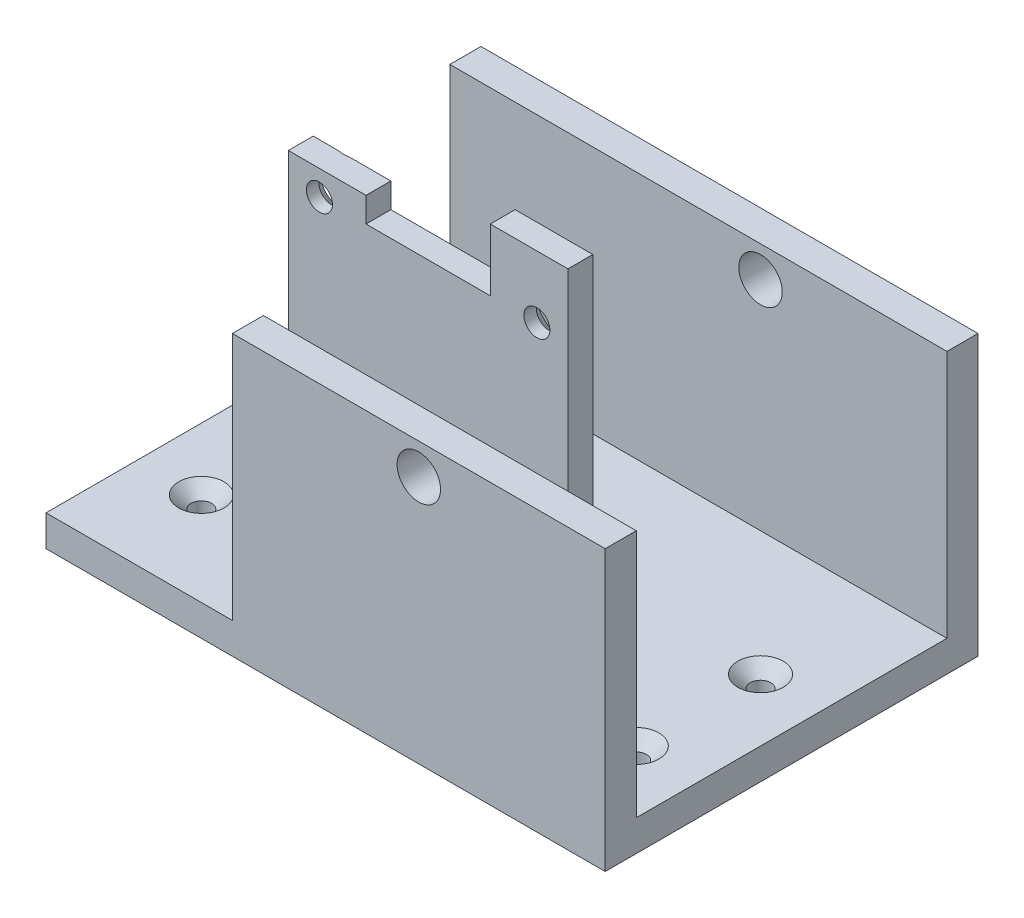
ISO-10303-21;
HEADER;
FILE_DESCRIPTION(('STEP AP214'),'2;1');
FILE_NAME('part.step','',(''),(''),'','','');
FILE_SCHEMA(('AUTOMOTIVE_DESIGN { 1 0 10303 214 1 1 1 1 }'));
ENDSEC;
DATA;
#1=APPLICATION_CONTEXT('core data for automotive mechanical design processes');
#2=APPLICATION_PROTOCOL_DEFINITION('international standard','automotive_design',2000,#1);
#3=PRODUCT_CONTEXT('',#1,'mechanical');
#4=PRODUCT('Part','Part','',(#3));
#5=PRODUCT_RELATED_PRODUCT_CATEGORY('part','',(#4));
#6=PRODUCT_DEFINITION_FORMATION('','',#4);
#7=PRODUCT_DEFINITION_CONTEXT('part definition',#1,'design');
#8=PRODUCT_DEFINITION('design','',#6,#7);
#9=PRODUCT_DEFINITION_SHAPE('','',#8);
#10=(LENGTH_UNIT() NAMED_UNIT(*) SI_UNIT(.MILLI.,.METRE.));
#11=(NAMED_UNIT(*) PLANE_ANGLE_UNIT() SI_UNIT($,.RADIAN.));
#12=(NAMED_UNIT(*) SI_UNIT($,.STERADIAN.) SOLID_ANGLE_UNIT());
#13=UNCERTAINTY_MEASURE_WITH_UNIT(LENGTH_MEASURE(1.E-05),#10,'distance_accuracy_value','');
#14=(GEOMETRIC_REPRESENTATION_CONTEXT(3) GLOBAL_UNCERTAINTY_ASSIGNED_CONTEXT((#13)) GLOBAL_UNIT_ASSIGNED_CONTEXT((#10,
#11,#12)) REPRESENTATION_CONTEXT('',''));
#15=CARTESIAN_POINT('',(0.,0.,0.));
#16=DIRECTION('',(0.,0.,1.));
#17=DIRECTION('',(1.,0.,0.));
#18=AXIS2_PLACEMENT_3D('',#15,#16,#17);
#19=CARTESIAN_POINT('',(0.,5.,0.));
#20=DIRECTION('',(0.,1.,0.));
#21=DIRECTION('',(0.,0.,1.));
#22=AXIS2_PLACEMENT_3D('',#19,#20,#21);
#23=PLANE('',#22);
#24=DIRECTION('',(1.,0.,0.));
#25=VECTOR('',#24,1.);
#26=CARTESIAN_POINT('',(-45.,5.,-25.));
#27=LINE('',#26,#25);
#28=CARTESIAN_POINT('',(-35.,5.,-25.));
#29=VERTEX_POINT('',#28);
#30=CARTESIAN_POINT('',(45.,5.,-25.));
#31=VERTEX_POINT('',#30);
#32=EDGE_CURVE('E196',#29,#31,#27,.T.);
#33=ORIENTED_EDGE('',*,*,#32,.F.);
#34=DIRECTION('',(0.,0.,-1.));
#35=VECTOR('',#34,1.);
#36=CARTESIAN_POINT('',(-35.,5.,-20.));
#37=LINE('',#36,#35);
#38=CARTESIAN_POINT('',(-35.,5.,-30.));
#39=VERTEX_POINT('',#38);
#40=EDGE_CURVE('E713',#29,#39,#37,.T.);
#41=ORIENTED_EDGE('',*,*,#40,.T.);
#42=DIRECTION('',(-1.,0.,0.));
#43=VECTOR('',#42,1.);
#44=CARTESIAN_POINT('',(-45.,5.,-30.));
#45=LINE('',#44,#43);
#46=CARTESIAN_POINT('',(-45.,5.,-30.));
#47=VERTEX_POINT('',#46);
#48=EDGE_CURVE('E181',#39,#47,#45,.T.);
#49=ORIENTED_EDGE('',*,*,#48,.T.);
#50=DIRECTION('',(0.,0.,-1.));
#51=VECTOR('',#50,1.);
#52=CARTESIAN_POINT('',(-45.,5.,30.));
#53=LINE('',#52,#51);
#54=CARTESIAN_POINT('',(-45.,5.,-13.0042004319093));
#55=VERTEX_POINT('',#54);
#56=EDGE_CURVE('E202',#55,#47,#53,.T.);
#57=ORIENTED_EDGE('',*,*,#56,.F.);
#58=DIRECTION('',(1.,0.,0.));
#59=VECTOR('',#58,1.);
#60=CARTESIAN_POINT('',(-45.,5.,-13.0042004319093));
#61=LINE('',#60,#59);
#62=CARTESIAN_POINT('',(0.,5.,-13.0042004319093));
#63=VERTEX_POINT('',#62);
#64=EDGE_CURVE('E668',#55,#63,#61,.T.);
#65=ORIENTED_EDGE('',*,*,#64,.T.);
#66=DIRECTION('',(0.,0.,1.));
#67=VECTOR('',#66,1.);
#68=CARTESIAN_POINT('',(0.,5.,-13.0042004319093));
#69=LINE('',#68,#67);
#70=CARTESIAN_POINT('',(0.,5.,-9.0042004319093));
#71=VERTEX_POINT('',#70);
#72=EDGE_CURVE('E676',#63,#71,#69,.T.);
#73=ORIENTED_EDGE('',*,*,#72,.T.);
#74=DIRECTION('',(1.,0.,0.));
#75=VECTOR('',#74,1.);
#76=CARTESIAN_POINT('',(-45.,5.,-9.0042004319093));
#77=LINE('',#76,#75);
#78=CARTESIAN_POINT('',(-45.,5.,-9.0042004319093));
#79=VERTEX_POINT('',#78);
#80=EDGE_CURVE('E664',#79,#71,#77,.T.);
#81=ORIENTED_EDGE('',*,*,#80,.F.);
#82=CARTESIAN_POINT('',(-45.,5.,30.));
#83=VERTEX_POINT('',#82);
#84=EDGE_CURVE('E204',#83,#79,#53,.T.);
#85=ORIENTED_EDGE('',*,*,#84,.F.);
#86=DIRECTION('',(1.,0.,0.));
#87=VECTOR('',#86,1.);
#88=CARTESIAN_POINT('',(-45.,5.,30.));
#89=LINE('',#88,#87);
#90=CARTESIAN_POINT('',(-15.,5.,30.));
#91=VERTEX_POINT('',#90);
#92=EDGE_CURVE('E727',#83,#91,#89,.T.);
#93=ORIENTED_EDGE('',*,*,#92,.T.);
#94=DIRECTION('',(0.,0.,1.));
#95=VECTOR('',#94,1.);
#96=CARTESIAN_POINT('',(-15.,5.,20.));
#97=LINE('',#96,#95);
#98=CARTESIAN_POINT('',(-15.,5.,25.));
#99=VERTEX_POINT('',#98);
#100=EDGE_CURVE('E732',#99,#91,#97,.T.);
#101=ORIENTED_EDGE('',*,*,#100,.F.);
#102=DIRECTION('',(-1.,0.,0.));
#103=VECTOR('',#102,1.);
#104=CARTESIAN_POINT('',(-45.,5.,25.));
#105=LINE('',#104,#103);
#106=CARTESIAN_POINT('',(45.,5.,25.));
#107=VERTEX_POINT('',#106);
#108=EDGE_CURVE('E688',#107,#99,#105,.T.);
#109=ORIENTED_EDGE('',*,*,#108,.F.);
#110=DIRECTION('',(0.,0.,-1.));
#111=VECTOR('',#110,1.);
#112=CARTESIAN_POINT('',(45.,5.,30.));
#113=LINE('',#112,#111);
#114=EDGE_CURVE('E199',#107,#31,#113,.T.);
#115=ORIENTED_EDGE('',*,*,#114,.T.);
#116=EDGE_LOOP('',(#33,#41,#49,#57,#65,#73,#81,#85,#93,#101,#109,#115));
#117=FACE_BOUND('',#116,.T.);
#118=CARTESIAN_POINT('',(-35.,5.,15.));
#119=DIRECTION('',(0.,1.,0.));
#120=DIRECTION('',(0.,0.,1.));
#121=AXIS2_PLACEMENT_3D('',#118,#119,#120);
#122=CIRCLE('',#121,3.65000000000002);
#123=CARTESIAN_POINT('',(-35.,5.,18.65));
#124=VERTEX_POINT('',#123);
#125=EDGE_CURVE('E254',#124,#124,#122,.F.);
#126=ORIENTED_EDGE('',*,*,#125,.T.);
#127=EDGE_LOOP('',(#126));
#128=FACE_BOUND('',#127,.T.);
#129=CARTESIAN_POINT('',(35.,5.,15.));
#130=DIRECTION('',(0.,1.,0.));
#131=DIRECTION('',(0.,0.,1.));
#132=AXIS2_PLACEMENT_3D('',#129,#130,#131);
#133=CIRCLE('',#132,3.65000000000002);
#134=CARTESIAN_POINT('',(35.,5.,18.65));
#135=VERTEX_POINT('',#134);
#136=EDGE_CURVE('E251',#135,#135,#133,.F.);
#137=ORIENTED_EDGE('',*,*,#136,.T.);
#138=EDGE_LOOP('',(#137));
#139=FACE_BOUND('',#138,.T.);
#140=CARTESIAN_POINT('',(35.,5.,-5.));
#141=DIRECTION('',(0.,1.,0.));
#142=DIRECTION('',(0.,0.,1.));
#143=AXIS2_PLACEMENT_3D('',#140,#141,#142);
#144=CIRCLE('',#143,3.65000000000006);
#145=CARTESIAN_POINT('',(35.,5.,-1.34999999999994));
#146=VERTEX_POINT('',#145);
#147=EDGE_CURVE('E248',#146,#146,#144,.F.);
#148=ORIENTED_EDGE('',*,*,#147,.T.);
#149=EDGE_LOOP('',(#148));
#150=FACE_BOUND('',#149,.T.);
#151=CARTESIAN_POINT('',(-35.,5.,-5.));
#152=DIRECTION('',(0.,1.,0.));
#153=DIRECTION('',(0.,0.,1.));
#154=AXIS2_PLACEMENT_3D('',#151,#152,#153);
#155=CIRCLE('',#154,3.65000000000003);
#156=CARTESIAN_POINT('',(-35.,5.,-1.34999999999997));
#157=VERTEX_POINT('',#156);
#158=EDGE_CURVE('E245',#157,#157,#155,.F.);
#159=ORIENTED_EDGE('',*,*,#158,.T.);
#160=EDGE_LOOP('',(#159));
#161=FACE_BOUND('',#160,.T.);
#162=ADVANCED_FACE('F39',(#117,#128,#139,#150,#161),#23,.T.);
#163=CARTESIAN_POINT('',(-45.,5.,-30.));
#164=DIRECTION('',(0.,0.,-1.));
#165=DIRECTION('',(-1.,0.,0.));
#166=AXIS2_PLACEMENT_3D('',#163,#164,#165);
#167=PLANE('',#166);
#168=ORIENTED_EDGE('',*,*,#48,.F.);
#169=DIRECTION('',(0.,-1.,0.));
#170=VECTOR('',#169,1.);
#171=CARTESIAN_POINT('',(-35.,45.,-30.));
#172=LINE('',#171,#170);
#173=CARTESIAN_POINT('',(-35.,45.,-30.));
#174=VERTEX_POINT('',#173);
#175=EDGE_CURVE('E169',#174,#39,#172,.T.);
#176=ORIENTED_EDGE('',*,*,#175,.F.);
#177=DIRECTION('',(-1.,0.,0.));
#178=VECTOR('',#177,1.);
#179=CARTESIAN_POINT('',(-45.,45.,-30.));
#180=LINE('',#179,#178);
#181=CARTESIAN_POINT('',(45.,45.,-30.));
#182=VERTEX_POINT('',#181);
#183=EDGE_CURVE('E178',#182,#174,#180,.T.);
#184=ORIENTED_EDGE('',*,*,#183,.F.);
#185=DIRECTION('',(0.,-1.,0.));
#186=VECTOR('',#185,1.);
#187=CARTESIAN_POINT('',(45.,5.,-30.));
#188=LINE('',#187,#186);
#189=CARTESIAN_POINT('',(45.,0.,-30.));
#190=VERTEX_POINT('',#189);
#191=EDGE_CURVE('E207',#182,#190,#188,.T.);
#192=ORIENTED_EDGE('',*,*,#191,.T.);
#193=DIRECTION('',(1.,0.,0.));
#194=VECTOR('',#193,1.);
#195=CARTESIAN_POINT('',(-45.,0.,-30.));
#196=LINE('',#195,#194);
#197=CARTESIAN_POINT('',(-45.,0.,-30.));
#198=VERTEX_POINT('',#197);
#199=EDGE_CURVE('E190',#198,#190,#196,.T.);
#200=ORIENTED_EDGE('',*,*,#199,.F.);
#201=DIRECTION('',(0.,-1.,0.));
#202=VECTOR('',#201,1.);
#203=CARTESIAN_POINT('',(-45.,5.,-30.));
#204=LINE('',#203,#202);
#205=EDGE_CURVE('E217',#47,#198,#204,.T.);
#206=ORIENTED_EDGE('',*,*,#205,.F.);
#207=EDGE_LOOP('',(#168,#176,#184,#192,#200,#206));
#208=FACE_BOUND('',#207,.T.);
#209=CARTESIAN_POINT('',(15.,40.,-30.));
#210=DIRECTION('',(0.,0.,-1.));
#211=DIRECTION('',(-1.,0.,0.));
#212=AXIS2_PLACEMENT_3D('',#209,#210,#211);
#213=CIRCLE('',#212,3.50000000000001);
#214=CARTESIAN_POINT('',(11.5,40.,-30.));
#215=VERTEX_POINT('',#214);
#216=EDGE_CURVE('E647',#215,#215,#213,.T.);
#217=ORIENTED_EDGE('',*,*,#216,.F.);
#218=EDGE_LOOP('',(#217));
#219=FACE_BOUND('',#218,.T.);
#220=ADVANCED_FACE('F176',(#208,#219),#167,.T.);
#221=CARTESIAN_POINT('',(-45.,5.,30.));
#222=DIRECTION('',(-1.,0.,0.));
#223=DIRECTION('',(0.,0.,1.));
#224=AXIS2_PLACEMENT_3D('',#221,#222,#223);
#225=PLANE('',#224);
#226=ORIENTED_EDGE('',*,*,#56,.T.);
#227=ORIENTED_EDGE('',*,*,#205,.T.);
#228=DIRECTION('',(0.,0.,-1.));
#229=VECTOR('',#228,1.);
#230=CARTESIAN_POINT('',(-45.,0.,30.));
#231=LINE('',#230,#229);
#232=CARTESIAN_POINT('',(-45.,0.,30.));
#233=VERTEX_POINT('',#232);
#234=EDGE_CURVE('E203',#233,#198,#231,.T.);
#235=ORIENTED_EDGE('',*,*,#234,.F.);
#236=DIRECTION('',(0.,-1.,0.));
#237=VECTOR('',#236,1.);
#238=CARTESIAN_POINT('',(-45.,5.,30.));
#239=LINE('',#238,#237);
#240=EDGE_CURVE('E220',#83,#233,#239,.T.);
#241=ORIENTED_EDGE('',*,*,#240,.F.);
#242=ORIENTED_EDGE('',*,*,#84,.T.);
#243=DIRECTION('',(0.,-1.,0.));
#244=VECTOR('',#243,1.);
#245=CARTESIAN_POINT('',(-45.,42.,-9.0042004319093));
#246=LINE('',#245,#244);
#247=CARTESIAN_POINT('',(-45.,36.0038306713095,-9.0042004319093));
#248=VERTEX_POINT('',#247);
#249=EDGE_CURVE('E673',#248,#79,#246,.T.);
#250=ORIENTED_EDGE('',*,*,#249,.F.);
#251=DIRECTION('',(0.,0.,1.));
#252=VECTOR('',#251,1.);
#253=CARTESIAN_POINT('',(-45.,36.0038306713095,-19.0042004319093));
#254=LINE('',#253,#252);
#255=CARTESIAN_POINT('',(-45.,36.0038306713095,-13.0042004319093));
#256=VERTEX_POINT('',#255);
#257=EDGE_CURVE('E720',#256,#248,#254,.T.);
#258=ORIENTED_EDGE('',*,*,#257,.F.);
#259=DIRECTION('',(0.,-1.,0.));
#260=VECTOR('',#259,1.);
#261=CARTESIAN_POINT('',(-45.,42.,-13.0042004319093));
#262=LINE('',#261,#260);
#263=EDGE_CURVE('E682',#256,#55,#262,.T.);
#264=ORIENTED_EDGE('',*,*,#263,.T.);
#265=EDGE_LOOP('',(#226,#227,#235,#241,#242,#250,#258,#264));
#266=FACE_BOUND('',#265,.T.);
#267=ADVANCED_FACE('F371',(#266),#225,.T.);
#268=CARTESIAN_POINT('',(-45.,5.,30.));
#269=DIRECTION('',(0.,0.,-1.));
#270=DIRECTION('',(-1.,0.,0.));
#271=AXIS2_PLACEMENT_3D('',#268,#269,#270);
#272=PLANE('',#271);
#273=CARTESIAN_POINT('',(15.,40.,30.));
#274=DIRECTION('',(0.,0.,1.));
#275=DIRECTION('',(1.,0.,0.));
#276=AXIS2_PLACEMENT_3D('',#273,#274,#275);
#277=CIRCLE('',#276,3.5);
#278=CARTESIAN_POINT('',(18.5,40.,30.));
#279=VERTEX_POINT('',#278);
#280=EDGE_CURVE('E749',#279,#279,#277,.T.);
#281=ORIENTED_EDGE('',*,*,#280,.F.);
#282=EDGE_LOOP('',(#281));
#283=FACE_BOUND('',#282,.T.);
#284=DIRECTION('',(1.,0.,0.));
#285=VECTOR('',#284,1.);
#286=CARTESIAN_POINT('',(-45.,45.,30.));
#287=LINE('',#286,#285);
#288=CARTESIAN_POINT('',(-15.,45.,30.));
#289=VERTEX_POINT('',#288);
#290=CARTESIAN_POINT('',(45.,45.,30.));
#291=VERTEX_POINT('',#290);
#292=EDGE_CURVE('E689',#289,#291,#287,.T.);
#293=ORIENTED_EDGE('',*,*,#292,.F.);
#294=DIRECTION('',(0.,1.,0.));
#295=VECTOR('',#294,1.);
#296=CARTESIAN_POINT('',(-15.,45.,30.));
#297=LINE('',#296,#295);
#298=EDGE_CURVE('E730',#91,#289,#297,.T.);
#299=ORIENTED_EDGE('',*,*,#298,.F.);
#300=ORIENTED_EDGE('',*,*,#92,.F.);
#301=ORIENTED_EDGE('',*,*,#240,.T.);
#302=DIRECTION('',(1.,0.,0.));
#303=VECTOR('',#302,1.);
#304=CARTESIAN_POINT('',(-45.,0.,30.));
#305=LINE('',#304,#303);
#306=CARTESIAN_POINT('',(45.,0.,30.));
#307=VERTEX_POINT('',#306);
#308=EDGE_CURVE('E213',#233,#307,#305,.T.);
#309=ORIENTED_EDGE('',*,*,#308,.T.);
#310=DIRECTION('',(0.,-1.,0.));
#311=VECTOR('',#310,1.);
#312=CARTESIAN_POINT('',(45.,5.,30.));
#313=LINE('',#312,#311);
#314=EDGE_CURVE('E222',#291,#307,#313,.T.);
#315=ORIENTED_EDGE('',*,*,#314,.F.);
#316=EDGE_LOOP('',(#293,#299,#300,#301,#309,#315));
#317=FACE_BOUND('',#316,.T.);
#318=ADVANCED_FACE('F374',(#283,#317),#272,.F.);
#319=CARTESIAN_POINT('',(45.,5.,30.));
#320=DIRECTION('',(-1.,0.,0.));
#321=DIRECTION('',(0.,0.,1.));
#322=AXIS2_PLACEMENT_3D('',#319,#320,#321);
#323=PLANE('',#322);
#324=DIRECTION('',(0.,0.,-1.));
#325=VECTOR('',#324,1.);
#326=CARTESIAN_POINT('',(45.,0.,30.));
#327=LINE('',#326,#325);
#328=EDGE_CURVE('E210',#307,#190,#327,.T.);
#329=ORIENTED_EDGE('',*,*,#328,.T.);
#330=ORIENTED_EDGE('',*,*,#191,.F.);
#331=DIRECTION('',(0.,0.,-1.));
#332=VECTOR('',#331,1.);
#333=CARTESIAN_POINT('',(45.,45.,-30.));
#334=LINE('',#333,#332);
#335=CARTESIAN_POINT('',(45.,45.,-25.));
#336=VERTEX_POINT('',#335);
#337=EDGE_CURVE('E186',#336,#182,#334,.T.);
#338=ORIENTED_EDGE('',*,*,#337,.F.);
#339=DIRECTION('',(0.,-1.,0.));
#340=VECTOR('',#339,1.);
#341=CARTESIAN_POINT('',(45.,45.,-25.));
#342=LINE('',#341,#340);
#343=EDGE_CURVE('E187',#336,#31,#342,.T.);
#344=ORIENTED_EDGE('',*,*,#343,.T.);
#345=ORIENTED_EDGE('',*,*,#114,.F.);
#346=DIRECTION('',(0.,-1.,0.));
#347=VECTOR('',#346,1.);
#348=CARTESIAN_POINT('',(45.,45.,25.));
#349=LINE('',#348,#347);
#350=CARTESIAN_POINT('',(45.,45.,25.));
#351=VERTEX_POINT('',#350);
#352=EDGE_CURVE('E197',#351,#107,#349,.T.);
#353=ORIENTED_EDGE('',*,*,#352,.F.);
#354=DIRECTION('',(0.,0.,-1.));
#355=VECTOR('',#354,1.);
#356=CARTESIAN_POINT('',(45.,45.,30.));
#357=LINE('',#356,#355);
#358=EDGE_CURVE('E691',#291,#351,#357,.T.);
#359=ORIENTED_EDGE('',*,*,#358,.F.);
#360=ORIENTED_EDGE('',*,*,#314,.T.);
#361=EDGE_LOOP('',(#329,#330,#338,#344,#345,#353,#359,#360));
#362=FACE_BOUND('',#361,.T.);
#363=ADVANCED_FACE('F369',(#362),#323,.F.);
#364=CARTESIAN_POINT('',(0.,0.,0.));
#365=DIRECTION('',(0.,1.,0.));
#366=DIRECTION('',(0.,0.,1.));
#367=AXIS2_PLACEMENT_3D('',#364,#365,#366);
#368=PLANE('',#367);
#369=CARTESIAN_POINT('',(-35.,0.,-5.));
#370=DIRECTION('',(0.,1.,0.));
#371=DIRECTION('',(0.,0.,1.));
#372=AXIS2_PLACEMENT_3D('',#369,#370,#371);
#373=CIRCLE('',#372,1.65);
#374=CARTESIAN_POINT('',(-35.,0.,-3.35));
#375=VERTEX_POINT('',#374);
#376=EDGE_CURVE('E737',#375,#375,#373,.T.);
#377=ORIENTED_EDGE('',*,*,#376,.T.);
#378=EDGE_LOOP('',(#377));
#379=FACE_BOUND('',#378,.T.);
#380=CARTESIAN_POINT('',(-35.,0.,15.));
#381=DIRECTION('',(0.,1.,0.));
#382=DIRECTION('',(0.,0.,1.));
#383=AXIS2_PLACEMENT_3D('',#380,#381,#382);
#384=CIRCLE('',#383,1.65);
#385=CARTESIAN_POINT('',(-35.,0.,16.65));
#386=VERTEX_POINT('',#385);
#387=EDGE_CURVE('E742',#386,#386,#384,.T.);
#388=ORIENTED_EDGE('',*,*,#387,.T.);
#389=EDGE_LOOP('',(#388));
#390=FACE_BOUND('',#389,.T.);
#391=CARTESIAN_POINT('',(35.,0.,15.));
#392=DIRECTION('',(0.,1.,0.));
#393=DIRECTION('',(0.,0.,1.));
#394=AXIS2_PLACEMENT_3D('',#391,#392,#393);
#395=CIRCLE('',#394,1.65);
#396=CARTESIAN_POINT('',(35.,0.,16.65));
#397=VERTEX_POINT('',#396);
#398=EDGE_CURVE('E738',#397,#397,#395,.T.);
#399=ORIENTED_EDGE('',*,*,#398,.T.);
#400=EDGE_LOOP('',(#399));
#401=FACE_BOUND('',#400,.T.);
#402=CARTESIAN_POINT('',(35.,0.,-5.));
#403=DIRECTION('',(0.,1.,0.));
#404=DIRECTION('',(0.,0.,1.));
#405=AXIS2_PLACEMENT_3D('',#402,#403,#404);
#406=CIRCLE('',#405,1.65);
#407=CARTESIAN_POINT('',(35.,0.,-3.34999999999999));
#408=VERTEX_POINT('',#407);
#409=EDGE_CURVE('E741',#408,#408,#406,.T.);
#410=ORIENTED_EDGE('',*,*,#409,.T.);
#411=EDGE_LOOP('',(#410));
#412=FACE_BOUND('',#411,.T.);
#413=ORIENTED_EDGE('',*,*,#199,.T.);
#414=ORIENTED_EDGE('',*,*,#328,.F.);
#415=ORIENTED_EDGE('',*,*,#308,.F.);
#416=ORIENTED_EDGE('',*,*,#234,.T.);
#417=EDGE_LOOP('',(#413,#414,#415,#416));
#418=FACE_BOUND('',#417,.T.);
#419=ADVANCED_FACE('F362',(#379,#390,#401,#412,#418),#368,.F.);
#420=CARTESIAN_POINT('',(-45.,45.,-25.));
#421=DIRECTION('',(0.,0.,-1.));
#422=DIRECTION('',(-1.,0.,0.));
#423=AXIS2_PLACEMENT_3D('',#420,#421,#422);
#424=PLANE('',#423);
#425=CARTESIAN_POINT('',(15.,40.,-25.));
#426=DIRECTION('',(0.,0.,-1.));
#427=DIRECTION('',(-1.,0.,0.));
#428=AXIS2_PLACEMENT_3D('',#425,#426,#427);
#429=CIRCLE('',#428,3.50000000000001);
#430=CARTESIAN_POINT('',(11.5,40.,-25.));
#431=VERTEX_POINT('',#430);
#432=EDGE_CURVE('E644',#431,#431,#429,.T.);
#433=ORIENTED_EDGE('',*,*,#432,.T.);
#434=EDGE_LOOP('',(#433));
#435=FACE_BOUND('',#434,.T.);
#436=DIRECTION('',(1.,0.,0.));
#437=VECTOR('',#436,1.);
#438=CARTESIAN_POINT('',(-45.,45.,-25.));
#439=LINE('',#438,#437);
#440=CARTESIAN_POINT('',(-35.,45.,-25.));
#441=VERTEX_POINT('',#440);
#442=EDGE_CURVE('E192',#441,#336,#439,.T.);
#443=ORIENTED_EDGE('',*,*,#442,.F.);
#444=DIRECTION('',(0.,-1.,0.));
#445=VECTOR('',#444,1.);
#446=CARTESIAN_POINT('',(-35.,45.,-25.));
#447=LINE('',#446,#445);
#448=EDGE_CURVE('E53',#441,#29,#447,.T.);
#449=ORIENTED_EDGE('',*,*,#448,.T.);
#450=ORIENTED_EDGE('',*,*,#32,.T.);
#451=ORIENTED_EDGE('',*,*,#343,.F.);
#452=EDGE_LOOP('',(#443,#449,#450,#451));
#453=FACE_BOUND('',#452,.T.);
#454=ADVANCED_FACE('F359',(#435,#453),#424,.F.);
#455=CARTESIAN_POINT('',(0.,45.,0.));
#456=DIRECTION('',(0.,1.,0.));
#457=DIRECTION('',(0.,0.,1.));
#458=AXIS2_PLACEMENT_3D('',#455,#456,#457);
#459=PLANE('',#458);
#460=DIRECTION('',(0.,0.,-1.));
#461=VECTOR('',#460,1.);
#462=CARTESIAN_POINT('',(-35.,45.,0.));
#463=LINE('',#462,#461);
#464=EDGE_CURVE('E11',#441,#174,#463,.T.);
#465=ORIENTED_EDGE('',*,*,#464,.F.);
#466=ORIENTED_EDGE('',*,*,#442,.T.);
#467=ORIENTED_EDGE('',*,*,#337,.T.);
#468=ORIENTED_EDGE('',*,*,#183,.T.);
#469=EDGE_LOOP('',(#465,#466,#467,#468));
#470=FACE_BOUND('',#469,.T.);
#471=ADVANCED_FACE('F184',(#470),#459,.T.);
#472=CARTESIAN_POINT('',(-45.,45.,25.));
#473=DIRECTION('',(0.,0.,1.));
#474=DIRECTION('',(1.,0.,0.));
#475=AXIS2_PLACEMENT_3D('',#472,#473,#474);
#476=PLANE('',#475);
#477=CARTESIAN_POINT('',(15.,40.,25.));
#478=DIRECTION('',(0.,0.,1.));
#479=DIRECTION('',(1.,0.,0.));
#480=AXIS2_PLACEMENT_3D('',#477,#478,#479);
#481=CIRCLE('',#480,3.5);
#482=CARTESIAN_POINT('',(18.5,40.,25.));
#483=VERTEX_POINT('',#482);
#484=EDGE_CURVE('E750',#483,#483,#481,.T.);
#485=ORIENTED_EDGE('',*,*,#484,.T.);
#486=EDGE_LOOP('',(#485));
#487=FACE_BOUND('',#486,.T.);
#488=ORIENTED_EDGE('',*,*,#108,.T.);
#489=DIRECTION('',(0.,1.,0.));
#490=VECTOR('',#489,1.);
#491=CARTESIAN_POINT('',(-15.,45.,25.));
#492=LINE('',#491,#490);
#493=CARTESIAN_POINT('',(-15.,45.,25.));
#494=VERTEX_POINT('',#493);
#495=EDGE_CURVE('E734',#99,#494,#492,.T.);
#496=ORIENTED_EDGE('',*,*,#495,.T.);
#497=DIRECTION('',(-1.,0.,0.));
#498=VECTOR('',#497,1.);
#499=CARTESIAN_POINT('',(-45.,45.,25.));
#500=LINE('',#499,#498);
#501=EDGE_CURVE('E693',#351,#494,#500,.T.);
#502=ORIENTED_EDGE('',*,*,#501,.F.);
#503=ORIENTED_EDGE('',*,*,#352,.T.);
#504=EDGE_LOOP('',(#488,#496,#502,#503));
#505=FACE_BOUND('',#504,.T.);
#506=ADVANCED_FACE('F352',(#487,#505),#476,.F.);
#507=CARTESIAN_POINT('',(0.,45.,0.));
#508=DIRECTION('',(0.,-1.,0.));
#509=DIRECTION('',(0.,0.,-1.));
#510=AXIS2_PLACEMENT_3D('',#507,#508,#509);
#511=PLANE('',#510);
#512=ORIENTED_EDGE('',*,*,#501,.T.);
#513=DIRECTION('',(0.,0.,1.));
#514=VECTOR('',#513,1.);
#515=CARTESIAN_POINT('',(-15.,45.,0.));
#516=LINE('',#515,#514);
#517=EDGE_CURVE('E266',#494,#289,#516,.T.);
#518=ORIENTED_EDGE('',*,*,#517,.T.);
#519=ORIENTED_EDGE('',*,*,#292,.T.);
#520=ORIENTED_EDGE('',*,*,#358,.T.);
#521=EDGE_LOOP('',(#512,#518,#519,#520));
#522=FACE_BOUND('',#521,.T.);
#523=ADVANCED_FACE('F348',(#522),#511,.F.);
#524=CARTESIAN_POINT('',(-45.,42.,-9.0042004319093));
#525=DIRECTION('',(0.,0.,-1.));
#526=DIRECTION('',(-1.,0.,0.));
#527=AXIS2_PLACEMENT_3D('',#524,#525,#526);
#528=PLANE('',#527);
#529=CARTESIAN_POINT('',(-4.99999999999999,32.,-9.0042004319093));
#530=DIRECTION('',(0.,0.,1.));
#531=DIRECTION('',(1.,0.,0.));
#532=AXIS2_PLACEMENT_3D('',#529,#530,#531);
#533=CIRCLE('',#532,2.1);
#534=CARTESIAN_POINT('',(-2.89999999999999,32.,-9.0042004319093));
#535=VERTEX_POINT('',#534);
#536=EDGE_CURVE('E639',#535,#535,#533,.T.);
#537=ORIENTED_EDGE('',*,*,#536,.F.);
#538=EDGE_LOOP('',(#537));
#539=FACE_BOUND('',#538,.T.);
#540=CARTESIAN_POINT('',(-40.,32.,-9.0042004319093));
#541=DIRECTION('',(0.,0.,1.));
#542=DIRECTION('',(1.,0.,0.));
#543=AXIS2_PLACEMENT_3D('',#540,#541,#542);
#544=CIRCLE('',#543,2.1);
#545=CARTESIAN_POINT('',(-37.9,32.,-9.0042004319093));
#546=VERTEX_POINT('',#545);
#547=EDGE_CURVE('E636',#546,#546,#544,.T.);
#548=ORIENTED_EDGE('',*,*,#547,.F.);
#549=EDGE_LOOP('',(#548));
#550=FACE_BOUND('',#549,.T.);
#551=DIRECTION('',(0.,-1.,0.));
#552=VECTOR('',#551,1.);
#553=CARTESIAN_POINT('',(-32.5,42.,-9.0042004319093));
#554=LINE('',#553,#552);
#555=CARTESIAN_POINT('',(-32.5,36.0038306713095,-9.0042004319093));
#556=VERTEX_POINT('',#555);
#557=CARTESIAN_POINT('',(-32.5,32.,-9.0042004319093));
#558=VERTEX_POINT('',#557);
#559=EDGE_CURVE('E638',#556,#558,#554,.T.);
#560=ORIENTED_EDGE('',*,*,#559,.F.);
#561=DIRECTION('',(1.,0.,0.));
#562=VECTOR('',#561,1.);
#563=CARTESIAN_POINT('',(-45.,36.0038306713095,-9.0042004319093));
#564=LINE('',#563,#562);
#565=EDGE_CURVE('E718',#248,#556,#564,.T.);
#566=ORIENTED_EDGE('',*,*,#565,.F.);
#567=ORIENTED_EDGE('',*,*,#249,.T.);
#568=ORIENTED_EDGE('',*,*,#80,.T.);
#569=DIRECTION('',(0.,-1.,0.));
#570=VECTOR('',#569,1.);
#571=CARTESIAN_POINT('',(0.,42.,-9.0042004319093));
#572=LINE('',#571,#570);
#573=CARTESIAN_POINT('',(0.,42.,-9.0042004319093));
#574=VERTEX_POINT('',#573);
#575=EDGE_CURVE('E686',#574,#71,#572,.T.);
#576=ORIENTED_EDGE('',*,*,#575,.F.);
#577=DIRECTION('',(1.,0.,0.));
#578=VECTOR('',#577,1.);
#579=CARTESIAN_POINT('',(-45.,42.,-9.0042004319093));
#580=LINE('',#579,#578);
#581=CARTESIAN_POINT('',(-12.5,42.,-9.0042004319093));
#582=VERTEX_POINT('',#581);
#583=EDGE_CURVE('E665',#582,#574,#580,.T.);
#584=ORIENTED_EDGE('',*,*,#583,.F.);
#585=DIRECTION('',(0.,1.,0.));
#586=VECTOR('',#585,1.);
#587=CARTESIAN_POINT('',(-12.5,42.,-9.0042004319093));
#588=LINE('',#587,#586);
#589=CARTESIAN_POINT('',(-12.5,32.,-9.0042004319093));
#590=VERTEX_POINT('',#589);
#591=EDGE_CURVE('E652',#590,#582,#588,.T.);
#592=ORIENTED_EDGE('',*,*,#591,.F.);
#593=DIRECTION('',(1.,0.,0.));
#594=VECTOR('',#593,1.);
#595=CARTESIAN_POINT('',(-32.5,32.,-9.0042004319093));
#596=LINE('',#595,#594);
#597=EDGE_CURVE('E641',#558,#590,#596,.T.);
#598=ORIENTED_EDGE('',*,*,#597,.F.);
#599=EDGE_LOOP('',(#560,#566,#567,#568,#576,#584,#592,#598));
#600=FACE_BOUND('',#599,.T.);
#601=ADVANCED_FACE('F344',(#539,#550,#600),#528,.F.);
#602=CARTESIAN_POINT('',(0.,42.,-13.0042004319093));
#603=DIRECTION('',(1.,0.,0.));
#604=DIRECTION('',(0.,0.,-1.));
#605=AXIS2_PLACEMENT_3D('',#602,#603,#604);
#606=PLANE('',#605);
#607=ORIENTED_EDGE('',*,*,#72,.F.);
#608=DIRECTION('',(0.,-1.,0.));
#609=VECTOR('',#608,1.);
#610=CARTESIAN_POINT('',(0.,42.,-13.0042004319093));
#611=LINE('',#610,#609);
#612=CARTESIAN_POINT('',(0.,42.,-13.0042004319093));
#613=VERTEX_POINT('',#612);
#614=EDGE_CURVE('E684',#613,#63,#611,.T.);
#615=ORIENTED_EDGE('',*,*,#614,.F.);
#616=DIRECTION('',(0.,0.,1.));
#617=VECTOR('',#616,1.);
#618=CARTESIAN_POINT('',(0.,42.,-13.0042004319093));
#619=LINE('',#618,#617);
#620=EDGE_CURVE('E667',#613,#574,#619,.T.);
#621=ORIENTED_EDGE('',*,*,#620,.T.);
#622=ORIENTED_EDGE('',*,*,#575,.T.);
#623=EDGE_LOOP('',(#607,#615,#621,#622));
#624=FACE_BOUND('',#623,.T.);
#625=ADVANCED_FACE('F340',(#624),#606,.T.);
#626=CARTESIAN_POINT('',(-45.,42.,-13.0042004319093));
#627=DIRECTION('',(0.,0.,-1.));
#628=DIRECTION('',(-1.,0.,0.));
#629=AXIS2_PLACEMENT_3D('',#626,#627,#628);
#630=PLANE('',#629);
#631=DIRECTION('',(-1.,0.,0.));
#632=VECTOR('',#631,1.);
#633=CARTESIAN_POINT('',(-45.,36.0038306713095,-13.0042004319093));
#634=LINE('',#633,#632);
#635=CARTESIAN_POINT('',(-32.5,36.0038306713095,-13.0042004319093));
#636=VERTEX_POINT('',#635);
#637=CARTESIAN_POINT('',(-39.117197669078,36.0038306713095,-13.0042004319093));
#638=VERTEX_POINT('',#637);
#639=EDGE_CURVE('E61',#636,#638,#634,.T.);
#640=ORIENTED_EDGE('',*,*,#639,.F.);
#641=DIRECTION('',(0.,1.,0.));
#642=VECTOR('',#641,1.);
#643=CARTESIAN_POINT('',(-32.5,42.,-13.0042004319093));
#644=LINE('',#643,#642);
#645=CARTESIAN_POINT('',(-32.5,32.,-13.0042004319093));
#646=VERTEX_POINT('',#645);
#647=EDGE_CURVE('E661',#646,#636,#644,.T.);
#648=ORIENTED_EDGE('',*,*,#647,.F.);
#649=DIRECTION('',(-1.,0.,0.));
#650=VECTOR('',#649,1.);
#651=CARTESIAN_POINT('',(-45.,32.,-13.0042004319093));
#652=LINE('',#651,#650);
#653=CARTESIAN_POINT('',(-12.5,32.,-13.0042004319093));
#654=VERTEX_POINT('',#653);
#655=EDGE_CURVE('E228',#654,#646,#652,.T.);
#656=ORIENTED_EDGE('',*,*,#655,.F.);
#657=DIRECTION('',(0.,-1.,0.));
#658=VECTOR('',#657,1.);
#659=CARTESIAN_POINT('',(-12.5,42.,-13.0042004319093));
#660=LINE('',#659,#658);
#661=CARTESIAN_POINT('',(-12.5,42.,-13.0042004319093));
#662=VERTEX_POINT('',#661);
#663=EDGE_CURVE('E657',#662,#654,#660,.T.);
#664=ORIENTED_EDGE('',*,*,#663,.F.);
#665=DIRECTION('',(1.,0.,0.));
#666=VECTOR('',#665,1.);
#667=CARTESIAN_POINT('',(-45.,42.,-13.0042004319093));
#668=LINE('',#667,#666);
#669=EDGE_CURVE('E671',#662,#613,#668,.T.);
#670=ORIENTED_EDGE('',*,*,#669,.T.);
#671=ORIENTED_EDGE('',*,*,#614,.T.);
#672=ORIENTED_EDGE('',*,*,#64,.F.);
#673=ORIENTED_EDGE('',*,*,#263,.F.);
#674=CARTESIAN_POINT('',(-40.882802330922,36.0038306713095,-13.0042004319093));
#675=VERTEX_POINT('',#674);
#676=EDGE_CURVE('E724',#675,#256,#634,.T.);
#677=ORIENTED_EDGE('',*,*,#676,.F.);
#678=CARTESIAN_POINT('',(-40.,32.,-13.0042004319093));
#679=DIRECTION('',(0.,0.,-1.));
#680=DIRECTION('',(-1.,0.,0.));
#681=AXIS2_PLACEMENT_3D('',#678,#679,#680);
#682=CIRCLE('',#681,4.10000000000002);
#683=EDGE_CURVE('E233',#675,#638,#682,.F.);
#684=ORIENTED_EDGE('',*,*,#683,.T.);
#685=EDGE_LOOP('',(#640,#648,#656,#664,#670,#671,#672,#673,#677,#684));
#686=FACE_BOUND('',#685,.T.);
#687=CARTESIAN_POINT('',(-4.99999999999999,32.,-13.0042004319093));
#688=DIRECTION('',(0.,0.,-1.));
#689=DIRECTION('',(-1.,0.,0.));
#690=AXIS2_PLACEMENT_3D('',#687,#688,#689);
#691=CIRCLE('',#690,4.10000000000002);
#692=CARTESIAN_POINT('',(-9.10000000000001,32.,-13.0042004319093));
#693=VERTEX_POINT('',#692);
#694=EDGE_CURVE('E239',#693,#693,#691,.F.);
#695=ORIENTED_EDGE('',*,*,#694,.T.);
#696=EDGE_LOOP('',(#695));
#697=FACE_BOUND('',#696,.T.);
#698=ADVANCED_FACE('F336',(#686,#697),#630,.T.);
#699=CARTESIAN_POINT('',(0.,42.,0.));
#700=DIRECTION('',(0.,-1.,0.));
#701=DIRECTION('',(0.,0.,-1.));
#702=AXIS2_PLACEMENT_3D('',#699,#700,#701);
#703=PLANE('',#702);
#704=ORIENTED_EDGE('',*,*,#669,.F.);
#705=DIRECTION('',(0.,0.,1.));
#706=VECTOR('',#705,1.);
#707=CARTESIAN_POINT('',(-12.5,42.,0.));
#708=LINE('',#707,#706);
#709=EDGE_CURVE('E219',#662,#582,#708,.T.);
#710=ORIENTED_EDGE('',*,*,#709,.T.);
#711=ORIENTED_EDGE('',*,*,#583,.T.);
#712=ORIENTED_EDGE('',*,*,#620,.F.);
#713=EDGE_LOOP('',(#704,#710,#711,#712));
#714=FACE_BOUND('',#713,.T.);
#715=ADVANCED_FACE('F332',(#714),#703,.F.);
#716=CARTESIAN_POINT('',(-32.5,42.,-14.0042004319093));
#717=DIRECTION('',(-1.,0.,0.));
#718=DIRECTION('',(0.,0.,1.));
#719=AXIS2_PLACEMENT_3D('',#716,#717,#718);
#720=PLANE('',#719);
#721=ORIENTED_EDGE('',*,*,#647,.T.);
#722=DIRECTION('',(0.,0.,1.));
#723=VECTOR('',#722,1.);
#724=CARTESIAN_POINT('',(-32.5,36.0038306713095,-19.0042004319093));
#725=LINE('',#724,#723);
#726=EDGE_CURVE('E721',#636,#556,#725,.T.);
#727=ORIENTED_EDGE('',*,*,#726,.T.);
#728=ORIENTED_EDGE('',*,*,#559,.T.);
#729=DIRECTION('',(0.,0.,1.));
#730=VECTOR('',#729,1.);
#731=CARTESIAN_POINT('',(-32.5,32.,-14.0042004319093));
#732=LINE('',#731,#730);
#733=EDGE_CURVE('E654',#646,#558,#732,.T.);
#734=ORIENTED_EDGE('',*,*,#733,.F.);
#735=EDGE_LOOP('',(#721,#727,#728,#734));
#736=FACE_BOUND('',#735,.T.);
#737=ADVANCED_FACE('F325',(#736),#720,.F.);
#738=CARTESIAN_POINT('',(-12.5,42.,-14.0042004319093));
#739=DIRECTION('',(1.,0.,0.));
#740=DIRECTION('',(0.,0.,-1.));
#741=AXIS2_PLACEMENT_3D('',#738,#739,#740);
#742=PLANE('',#741);
#743=ORIENTED_EDGE('',*,*,#663,.T.);
#744=DIRECTION('',(0.,0.,1.));
#745=VECTOR('',#744,1.);
#746=CARTESIAN_POINT('',(-12.5,32.,-14.0042004319093));
#747=LINE('',#746,#745);
#748=EDGE_CURVE('E655',#654,#590,#747,.T.);
#749=ORIENTED_EDGE('',*,*,#748,.T.);
#750=ORIENTED_EDGE('',*,*,#591,.T.);
#751=ORIENTED_EDGE('',*,*,#709,.F.);
#752=EDGE_LOOP('',(#743,#749,#750,#751));
#753=FACE_BOUND('',#752,.T.);
#754=ADVANCED_FACE('F322',(#753),#742,.F.);
#755=CARTESIAN_POINT('',(-32.5,32.,-14.0042004319093));
#756=DIRECTION('',(0.,-1.,0.));
#757=DIRECTION('',(0.,0.,-1.));
#758=AXIS2_PLACEMENT_3D('',#755,#756,#757);
#759=PLANE('',#758);
#760=ORIENTED_EDGE('',*,*,#655,.T.);
#761=ORIENTED_EDGE('',*,*,#733,.T.);
#762=ORIENTED_EDGE('',*,*,#597,.T.);
#763=ORIENTED_EDGE('',*,*,#748,.F.);
#764=EDGE_LOOP('',(#760,#761,#762,#763));
#765=FACE_BOUND('',#764,.T.);
#766=ADVANCED_FACE('F317',(#765),#759,.F.);
#767=CARTESIAN_POINT('',(-40.,32.,-14.0042004319093));
#768=DIRECTION('',(0.,0.,1.));
#769=DIRECTION('',(1.,0.,0.));
#770=AXIS2_PLACEMENT_3D('',#767,#768,#769);
#771=CYLINDRICAL_SURFACE('',#770,2.1);
#772=CARTESIAN_POINT('',(-40.,32.,-11.0042004319093));
#773=DIRECTION('',(0.,0.,-1.));
#774=DIRECTION('',(-1.,0.,0.));
#775=AXIS2_PLACEMENT_3D('',#772,#773,#774);
#776=CIRCLE('',#775,2.1);
#777=CARTESIAN_POINT('',(-42.1,32.,-11.0042004319093));
#778=VERTEX_POINT('',#777);
#779=EDGE_CURVE('E230',#778,#778,#776,.T.);
#780=ORIENTED_EDGE('',*,*,#779,.T.);
#781=EDGE_LOOP('',(#780));
#782=FACE_BOUND('',#781,.T.);
#783=ORIENTED_EDGE('',*,*,#547,.T.);
#784=EDGE_LOOP('',(#783));
#785=FACE_BOUND('',#784,.T.);
#786=ADVANCED_FACE('F313',(#782,#785),#771,.F.);
#787=CARTESIAN_POINT('',(-4.99999999999999,32.,-14.0042004319093));
#788=DIRECTION('',(0.,0.,1.));
#789=DIRECTION('',(1.,0.,0.));
#790=AXIS2_PLACEMENT_3D('',#787,#788,#789);
#791=CYLINDRICAL_SURFACE('',#790,2.1);
#792=CARTESIAN_POINT('',(-4.99999999999999,32.,-11.0042004319093));
#793=DIRECTION('',(0.,0.,-1.));
#794=DIRECTION('',(-1.,0.,0.));
#795=AXIS2_PLACEMENT_3D('',#792,#793,#794);
#796=CIRCLE('',#795,2.1);
#797=CARTESIAN_POINT('',(-7.09999999999999,32.,-11.0042004319093));
#798=VERTEX_POINT('',#797);
#799=EDGE_CURVE('E236',#798,#798,#796,.T.);
#800=ORIENTED_EDGE('',*,*,#799,.T.);
#801=EDGE_LOOP('',(#800));
#802=FACE_BOUND('',#801,.T.);
#803=ORIENTED_EDGE('',*,*,#536,.T.);
#804=EDGE_LOOP('',(#803));
#805=FACE_BOUND('',#804,.T.);
#806=ADVANCED_FACE('F316',(#802,#805),#791,.F.);
#807=CARTESIAN_POINT('',(-40.,32.,-11.0042004319093));
#808=DIRECTION('',(0.,0.,-1.));
#809=DIRECTION('',(-1.,0.,0.));
#810=AXIS2_PLACEMENT_3D('',#807,#808,#809);
#811=CONICAL_SURFACE('',#810,2.1,0.785398163397447);
#812=CARTESIAN_POINT('',(-28.115747180321,36.0038306713095,-21.444779570313));
#813=CARTESIAN_POINT('',(-28.3107697663734,36.0038306713095,-21.2599676182644));
#814=CARTESIAN_POINT('',(-28.5060199225639,36.0038306713095,-21.0753955608));
#815=CARTESIAN_POINT('',(-28.8970554083435,36.0038306713095,-20.7068169456891));
#816=CARTESIAN_POINT('',(-29.0928407411543,36.0038306713095,-20.5228103914611));
#817=CARTESIAN_POINT('',(-29.6816286149012,36.0038306713095,-19.9712907454596));
#818=CARTESIAN_POINT('',(-30.0755536447311,36.0038306713095,-19.6047612361032));
#819=CARTESIAN_POINT('',(-30.8858202377929,36.0038306713095,-18.8577397626627));
#820=CARTESIAN_POINT('',(-31.3023270561736,36.0038306713095,-18.4774263983641));
#821=CARTESIAN_POINT('',(-31.9308342415292,36.0038306713095,-17.9116355961551));
#822=CARTESIAN_POINT('',(-32.1408305328755,36.0038306713095,-17.7239328001979));
#823=CARTESIAN_POINT('',(-32.5624653325616,36.0038306713095,-17.3503823909514));
#824=CARTESIAN_POINT('',(-32.7741038247031,36.0038306713095,-17.1645347594045));
#825=CARTESIAN_POINT('',(-33.1990569022544,36.0038306713095,-16.7954870803501));
#826=CARTESIAN_POINT('',(-33.4123680744827,36.0038306713095,-16.612283109424));
#827=CARTESIAN_POINT('',(-33.8415505407249,36.0038306713095,-16.2488660364626));
#828=CARTESIAN_POINT('',(-34.0574219865891,36.0038306713095,-16.0686531133633));
#829=CARTESIAN_POINT('',(-34.4932898123743,36.0038306713095,-15.7114634659351));
#830=CARTESIAN_POINT('',(-34.7132992784729,36.0038306713095,-15.5345026487607));
#831=CARTESIAN_POINT('',(-35.1575310298955,36.0038306713095,-15.1860134106544));
#832=CARTESIAN_POINT('',(-35.3817525551134,36.0038306713095,-15.014484024292));
#833=CARTESIAN_POINT('',(-35.8305427039713,36.0038306713095,-14.6828354790371));
#834=CARTESIAN_POINT('',(-36.0549824913638,36.0038306713095,-14.5225438952216));
#835=CARTESIAN_POINT('',(-36.3970574614495,36.0038306713095,-14.2898223083173));
#836=CARTESIAN_POINT('',(-36.51204277655,36.0038306713095,-14.2134988419267));
#837=CARTESIAN_POINT('',(-36.7440625993515,36.0038306713095,-14.0640354569362));
#838=CARTESIAN_POINT('',(-36.8610969758986,36.0038306713095,-13.9908953356174));
#839=CARTESIAN_POINT('',(-37.0967020457577,36.0038306713095,-13.848997560142));
#840=CARTESIAN_POINT('',(-37.2152565371597,36.0038306713095,-13.7802131177998));
#841=CARTESIAN_POINT('',(-37.4550208564895,36.0038306713095,-13.6473656338252));
#842=CARTESIAN_POINT('',(-37.5762310614292,36.0038306713095,-13.5833032682591));
#843=CARTESIAN_POINT('',(-37.8213613948664,36.0038306713095,-13.4611571092362));
#844=CARTESIAN_POINT('',(-37.9452760266638,36.0038306713095,-13.4030623502852));
#845=CARTESIAN_POINT('',(-38.1962455154421,36.0038306713095,-13.2941233675057));
#846=CARTESIAN_POINT('',(-38.3232991983344,36.0038306713095,-13.2432764795453));
#847=CARTESIAN_POINT('',(-38.5106177657633,36.0038306713095,-13.1757256801944));
#848=CARTESIAN_POINT('',(-38.5696192846983,36.0038306713095,-13.1554944399176));
#849=CARTESIAN_POINT('',(-38.6882740302284,36.0038306713095,-13.1170537081957));
#850=CARTESIAN_POINT('',(-38.7479272307911,36.0038306713095,-13.0988441363142));
#851=CARTESIAN_POINT('',(-38.9278827587787,36.0038306713095,-13.0474943964021));
#852=CARTESIAN_POINT('',(-39.0491513488842,36.0038306713095,-13.0176440701645));
#853=CARTESIAN_POINT('',(-39.2930829669464,36.0038306713095,-12.9682152426933));
#854=CARTESIAN_POINT('',(-39.4157345236601,36.0038306713095,-12.9485806641312));
#855=CARTESIAN_POINT('',(-39.6623014095015,36.0038306713095,-12.9203820853168));
#856=CARTESIAN_POINT('',(-39.7862164675775,36.0038306713095,-12.9118157590006));
#857=CARTESIAN_POINT('',(-40.0349524563885,36.0038306713095,-12.9062430469449));
#858=CARTESIAN_POINT('',(-40.1597747573788,36.0038306713095,-12.909296685857));
#859=CARTESIAN_POINT('',(-40.4085939197031,36.0038306713095,-12.9269110472309));
#860=CARTESIAN_POINT('',(-40.5325907508457,36.0038306713095,-12.9414721882693));
#861=CARTESIAN_POINT('',(-40.7794630098201,36.0038306713095,-12.9813679493321));
#862=CARTESIAN_POINT('',(-40.9023295091695,36.0038306713095,-13.0067570648433));
#863=CARTESIAN_POINT('',(-41.1456743618563,36.0038306713095,-13.0670512318033));
#864=CARTESIAN_POINT('',(-41.2661524201526,36.0038306713095,-13.1019574511276));
#865=CARTESIAN_POINT('',(-41.6285657148948,36.0038306713095,-13.2204430406468));
#866=CARTESIAN_POINT('',(-41.8663329835584,36.0038306713095,-13.3168555845787));
#867=CARTESIAN_POINT('',(-42.2148025144395,36.0038306713095,-13.4786319578783));
#868=CARTESIAN_POINT('',(-42.3297102440519,36.0038306713095,-13.5354848283415));
#869=CARTESIAN_POINT('',(-42.5570671285692,36.0038306713095,-13.6539198872791));
#870=CARTESIAN_POINT('',(-42.6695166417266,36.0038306713095,-13.7155013806363));
#871=CARTESIAN_POINT('',(-42.8936068708858,36.0038306713095,-13.8433344502915));
#872=CARTESIAN_POINT('',(-43.0052191128249,36.0038306713095,-13.9096354595004));
#873=CARTESIAN_POINT('',(-43.2264388583458,36.0038306713095,-14.0454989302888));
#874=CARTESIAN_POINT('',(-43.3360463215684,36.0038306713095,-14.115061457427));
#875=CARTESIAN_POINT('',(-43.5534015727792,36.0038306713095,-14.2568204833132));
#876=CARTESIAN_POINT('',(-43.6611509062036,36.0038306713095,-14.3290146205433));
#877=CARTESIAN_POINT('',(-43.8751031085137,36.0038306713095,-14.4756476420297));
#878=CARTESIAN_POINT('',(-43.9813060142821,36.0038306713095,-14.5500864726191));
#879=CARTESIAN_POINT('',(-44.2706625404997,36.0038306713095,-14.7567744718312));
#880=CARTESIAN_POINT('',(-44.4524477117324,36.0038306713095,-14.8909392381658));
#881=CARTESIAN_POINT('',(-44.8127767799284,36.0038306713095,-15.1635640693177));
#882=CARTESIAN_POINT('',(-44.9913203466269,36.0038306713095,-15.3020245679476));
#883=CARTESIAN_POINT('',(-45.3458463094768,36.0038306713095,-15.5822951796799));
#884=CARTESIAN_POINT('',(-45.5218278611321,36.0038306713095,-15.72410635857));
#885=CARTESIAN_POINT('',(-45.8716682931107,36.0038306713095,-16.0103274936641));
#886=CARTESIAN_POINT('',(-46.0455271095728,36.0038306713095,-16.1547375277313));
#887=CARTESIAN_POINT('',(-46.3918165603809,36.0038306713095,-16.4458963559551));
#888=CARTESIAN_POINT('',(-46.5642439950372,36.0038306713095,-16.5926489498294));
#889=CARTESIAN_POINT('',(-46.907647001995,36.0038306713095,-16.8878445379595));
#890=CARTESIAN_POINT('',(-47.0786225574975,36.0038306713095,-17.0362875517281));
#891=CARTESIAN_POINT('',(-47.5896688246023,36.0038306713095,-17.483621068517));
#892=CARTESIAN_POINT('',(-47.9279312413513,36.0038306713095,-17.7845771312709));
#893=CARTESIAN_POINT('',(-48.5708484296608,36.0038306713095,-18.3631850370799));
#894=CARTESIAN_POINT('',(-48.8757992421087,36.0038306713095,-18.640509291852));
#895=CARTESIAN_POINT('',(-49.4835299490608,36.0038306713095,-19.1975597799526));
#896=CARTESIAN_POINT('',(-49.7863097179259,36.0038306713095,-19.4772861502664));
#897=CARTESIAN_POINT('',(-50.3890512129188,36.0038306713095,-20.037515357575));
#898=CARTESIAN_POINT('',(-50.6890192325121,36.0038306713095,-20.3180114334589));
#899=CARTESIAN_POINT('',(-51.2875792144837,36.0038306713095,-20.8804197728489));
#900=CARTESIAN_POINT('',(-51.5861712870662,36.0038306713095,-21.1623319190199));
#901=CARTESIAN_POINT('',(-51.884252819679,36.0038306713095,-21.444779570313));
#902=B_SPLINE_CURVE_WITH_KNOTS('',3,(#812,#813,#814,#815,#816,#817,#818,#819,#820,#821,#822,
#823,#824,#825,#826,#827,#828,#829,#830,#831,#832,#833,#834,#835,#836,#837,#838,#839,#840,#841,
#842,#843,#844,#845,#846,#847,#848,#849,#850,#851,#852,#853,#854,#855,#856,#857,#858,#859,#860,
#861,#862,#863,#864,#865,#866,#867,#868,#869,#870,#871,#872,#873,#874,#875,#876,#877,#878,#879,
#880,#881,#882,#883,#884,#885,#886,#887,#888,#889,#890,#891,#892,#893,#894,#895,#896,#897,#898,
#899,#900,#901),.UNSPECIFIED.,.F.,.F.,(4,2,2,2,2,2,2,2,2,2,2,2,2,2,2,2,2,2,2,2,2,2,2,2,2,2,2,2,
2,2,2,2,2,2,2,2,2,2,2,2,2,2,2,2,4),(0.,0.806041765595709,1.61208839429363,3.22628869339715,
4.91829753198313,5.76326089626725,6.60821593656904,7.45175144659661,8.29533723953929,
9.1423116042539,9.98913456538964,10.8163034712041,11.2302945722545,11.6442592712288,
12.0553637639653,12.4665270012308,12.8769206766015,13.2871631106064,13.4742525349047,
13.6613345127689,14.0355930292733,14.4077748566241,14.7798784548591,15.15390681227,
15.527948775298,15.9038958697353,16.2798891186724,17.0474223868462,17.4319866158796,
17.8164944210201,18.2058923283269,18.5952980661635,18.9843625746329,19.3734177885731,
20.0511248733774,20.7289006219365,21.4068949402324,22.084909605567,22.7641663119709,
23.4434308670623,24.8016765141187,26.0382445108732,27.2748834999213,28.5069214608659,
29.7388589662457),.UNSPECIFIED.);
#903=EDGE_CURVE('E47',#638,#675,#902,.T.);
#904=ORIENTED_EDGE('',*,*,#903,.F.);
#905=ORIENTED_EDGE('',*,*,#683,.F.);
#906=EDGE_LOOP('',(#904,#905));
#907=FACE_BOUND('',#906,.T.);
#908=ORIENTED_EDGE('',*,*,#779,.F.);
#909=EDGE_LOOP('',(#908));
#910=FACE_BOUND('',#909,.T.);
#911=ADVANCED_FACE('F274',(#907,#910),#811,.F.);
#912=CARTESIAN_POINT('',(-4.99999999999999,32.,-11.0042004319093));
#913=DIRECTION('',(0.,0.,-1.));
#914=DIRECTION('',(-1.,0.,0.));
#915=AXIS2_PLACEMENT_3D('',#912,#913,#914);
#916=CONICAL_SURFACE('',#915,2.1,0.785398163397447);
#917=ORIENTED_EDGE('',*,*,#694,.F.);
#918=EDGE_LOOP('',(#917));
#919=FACE_BOUND('',#918,.T.);
#920=ORIENTED_EDGE('',*,*,#799,.F.);
#921=EDGE_LOOP('',(#920));
#922=FACE_BOUND('',#921,.T.);
#923=ADVANCED_FACE('F311',(#919,#922),#916,.F.);
#924=CARTESIAN_POINT('',(15.,40.,-25.));
#925=DIRECTION('',(0.,0.,-1.));
#926=DIRECTION('',(-1.,0.,0.));
#927=AXIS2_PLACEMENT_3D('',#924,#925,#926);
#928=CYLINDRICAL_SURFACE('',#927,3.50000000000001);
#929=ORIENTED_EDGE('',*,*,#432,.F.);
#930=EDGE_LOOP('',(#929));
#931=FACE_BOUND('',#930,.T.);
#932=ORIENTED_EDGE('',*,*,#216,.T.);
#933=EDGE_LOOP('',(#932));
#934=FACE_BOUND('',#933,.T.);
#935=ADVANCED_FACE('F307',(#931,#934),#928,.F.);
#936=CARTESIAN_POINT('',(15.,40.,25.));
#937=DIRECTION('',(0.,0.,1.));
#938=DIRECTION('',(1.,0.,0.));
#939=AXIS2_PLACEMENT_3D('',#936,#937,#938);
#940=CYLINDRICAL_SURFACE('',#939,3.5);
#941=ORIENTED_EDGE('',*,*,#484,.F.);
#942=EDGE_LOOP('',(#941));
#943=FACE_BOUND('',#942,.T.);
#944=ORIENTED_EDGE('',*,*,#280,.T.);
#945=EDGE_LOOP('',(#944));
#946=FACE_BOUND('',#945,.T.);
#947=ADVANCED_FACE('F303',(#943,#946),#940,.F.);
#948=CARTESIAN_POINT('',(35.,0.,-5.));
#949=DIRECTION('',(0.,1.,0.));
#950=DIRECTION('',(0.,0.,1.));
#951=AXIS2_PLACEMENT_3D('',#948,#949,#950);
#952=CYLINDRICAL_SURFACE('',#951,1.65);
#953=CARTESIAN_POINT('',(35.,2.99999999999996,-5.));
#954=DIRECTION('',(0.,1.,0.));
#955=DIRECTION('',(0.,0.,1.));
#956=AXIS2_PLACEMENT_3D('',#953,#954,#955);
#957=CIRCLE('',#956,1.65);
#958=CARTESIAN_POINT('',(35.,2.99999999999996,-3.34999999999999));
#959=VERTEX_POINT('',#958);
#960=EDGE_CURVE('E260',#959,#959,#957,.T.);
#961=ORIENTED_EDGE('',*,*,#960,.T.);
#962=EDGE_LOOP('',(#961));
#963=FACE_BOUND('',#962,.T.);
#964=ORIENTED_EDGE('',*,*,#409,.F.);
#965=EDGE_LOOP('',(#964));
#966=FACE_BOUND('',#965,.T.);
#967=ADVANCED_FACE('F291',(#963,#966),#952,.F.);
#968=CARTESIAN_POINT('',(35.,0.,15.));
#969=DIRECTION('',(0.,1.,0.));
#970=DIRECTION('',(0.,0.,1.));
#971=AXIS2_PLACEMENT_3D('',#968,#969,#970);
#972=CYLINDRICAL_SURFACE('',#971,1.65);
#973=CARTESIAN_POINT('',(35.,3.,15.));
#974=DIRECTION('',(0.,1.,0.));
#975=DIRECTION('',(0.,0.,1.));
#976=AXIS2_PLACEMENT_3D('',#973,#974,#975);
#977=CIRCLE('',#976,1.65);
#978=CARTESIAN_POINT('',(35.,3.,16.65));
#979=VERTEX_POINT('',#978);
#980=EDGE_CURVE('E257',#979,#979,#977,.T.);
#981=ORIENTED_EDGE('',*,*,#980,.T.);
#982=EDGE_LOOP('',(#981));
#983=FACE_BOUND('',#982,.T.);
#984=ORIENTED_EDGE('',*,*,#398,.F.);
#985=EDGE_LOOP('',(#984));
#986=FACE_BOUND('',#985,.T.);
#987=ADVANCED_FACE('F287',(#983,#986),#972,.F.);
#988=CARTESIAN_POINT('',(-35.,0.,15.));
#989=DIRECTION('',(0.,1.,0.));
#990=DIRECTION('',(0.,0.,1.));
#991=AXIS2_PLACEMENT_3D('',#988,#989,#990);
#992=CYLINDRICAL_SURFACE('',#991,1.65);
#993=CARTESIAN_POINT('',(-35.,3.,15.));
#994=DIRECTION('',(0.,1.,0.));
#995=DIRECTION('',(0.,0.,1.));
#996=AXIS2_PLACEMENT_3D('',#993,#994,#995);
#997=CIRCLE('',#996,1.65);
#998=CARTESIAN_POINT('',(-35.,3.,16.65));
#999=VERTEX_POINT('',#998);
#1000=EDGE_CURVE('E242',#999,#999,#997,.T.);
#1001=ORIENTED_EDGE('',*,*,#1000,.T.);
#1002=EDGE_LOOP('',(#1001));
#1003=FACE_BOUND('',#1002,.T.);
#1004=ORIENTED_EDGE('',*,*,#387,.F.);
#1005=EDGE_LOOP('',(#1004));
#1006=FACE_BOUND('',#1005,.T.);
#1007=ADVANCED_FACE('F290',(#1003,#1006),#992,.F.);
#1008=CARTESIAN_POINT('',(-35.,0.,-5.));
#1009=DIRECTION('',(0.,1.,0.));
#1010=DIRECTION('',(0.,0.,1.));
#1011=AXIS2_PLACEMENT_3D('',#1008,#1009,#1010);
#1012=CYLINDRICAL_SURFACE('',#1011,1.65);
#1013=CARTESIAN_POINT('',(-35.,2.99999999999997,-5.));
#1014=DIRECTION('',(0.,1.,0.));
#1015=DIRECTION('',(0.,0.,1.));
#1016=AXIS2_PLACEMENT_3D('',#1013,#1014,#1015);
#1017=CIRCLE('',#1016,1.65);
#1018=CARTESIAN_POINT('',(-35.,2.99999999999997,-3.35));
#1019=VERTEX_POINT('',#1018);
#1020=EDGE_CURVE('E263',#1019,#1019,#1017,.T.);
#1021=ORIENTED_EDGE('',*,*,#1020,.T.);
#1022=EDGE_LOOP('',(#1021));
#1023=FACE_BOUND('',#1022,.T.);
#1024=ORIENTED_EDGE('',*,*,#376,.F.);
#1025=EDGE_LOOP('',(#1024));
#1026=FACE_BOUND('',#1025,.T.);
#1027=ADVANCED_FACE('F295',(#1023,#1026),#1012,.F.);
#1028=CARTESIAN_POINT('',(-35.,3.,15.));
#1029=DIRECTION('',(0.,1.,0.));
#1030=DIRECTION('',(0.,0.,1.));
#1031=AXIS2_PLACEMENT_3D('',#1028,#1029,#1030);
#1032=CONICAL_SURFACE('',#1031,1.65,0.785398163397451);
#1033=ORIENTED_EDGE('',*,*,#125,.F.);
#1034=EDGE_LOOP('',(#1033));
#1035=FACE_BOUND('',#1034,.T.);
#1036=ORIENTED_EDGE('',*,*,#1000,.F.);
#1037=EDGE_LOOP('',(#1036));
#1038=FACE_BOUND('',#1037,.T.);
#1039=ADVANCED_FACE('F299',(#1035,#1038),#1032,.F.);
#1040=CARTESIAN_POINT('',(35.,3.,15.));
#1041=DIRECTION('',(0.,1.,0.));
#1042=DIRECTION('',(0.,0.,1.));
#1043=AXIS2_PLACEMENT_3D('',#1040,#1041,#1042);
#1044=CONICAL_SURFACE('',#1043,1.65,0.785398163397451);
#1045=ORIENTED_EDGE('',*,*,#136,.F.);
#1046=EDGE_LOOP('',(#1045));
#1047=FACE_BOUND('',#1046,.T.);
#1048=ORIENTED_EDGE('',*,*,#980,.F.);
#1049=EDGE_LOOP('',(#1048));
#1050=FACE_BOUND('',#1049,.T.);
#1051=ADVANCED_FACE('F431',(#1047,#1050),#1044,.F.);
#1052=CARTESIAN_POINT('',(35.,2.99999999999996,-5.));
#1053=DIRECTION('',(0.,1.,0.));
#1054=DIRECTION('',(0.,0.,1.));
#1055=AXIS2_PLACEMENT_3D('',#1052,#1053,#1054);
#1056=CONICAL_SURFACE('',#1055,1.65,0.78539816339745);
#1057=ORIENTED_EDGE('',*,*,#147,.F.);
#1058=EDGE_LOOP('',(#1057));
#1059=FACE_BOUND('',#1058,.T.);
#1060=ORIENTED_EDGE('',*,*,#960,.F.);
#1061=EDGE_LOOP('',(#1060));
#1062=FACE_BOUND('',#1061,.T.);
#1063=ADVANCED_FACE('F424',(#1059,#1062),#1056,.F.);
#1064=CARTESIAN_POINT('',(-35.,2.99999999999997,-5.));
#1065=DIRECTION('',(0.,1.,0.));
#1066=DIRECTION('',(0.,0.,1.));
#1067=AXIS2_PLACEMENT_3D('',#1064,#1065,#1066);
#1068=CONICAL_SURFACE('',#1067,1.65,0.785398163397447);
#1069=ORIENTED_EDGE('',*,*,#158,.F.);
#1070=EDGE_LOOP('',(#1069));
#1071=FACE_BOUND('',#1070,.T.);
#1072=ORIENTED_EDGE('',*,*,#1020,.F.);
#1073=EDGE_LOOP('',(#1072));
#1074=FACE_BOUND('',#1073,.T.);
#1075=ADVANCED_FACE('F41',(#1071,#1074),#1068,.F.);
#1076=CARTESIAN_POINT('',(-15.,45.,20.));
#1077=DIRECTION('',(1.,0.,0.));
#1078=DIRECTION('',(0.,1.,0.));
#1079=AXIS2_PLACEMENT_3D('',#1076,#1077,#1078);
#1080=PLANE('',#1079);
#1081=ORIENTED_EDGE('',*,*,#100,.T.);
#1082=ORIENTED_EDGE('',*,*,#298,.T.);
#1083=ORIENTED_EDGE('',*,*,#517,.F.);
#1084=ORIENTED_EDGE('',*,*,#495,.F.);
#1085=EDGE_LOOP('',(#1081,#1082,#1083,#1084));
#1086=FACE_BOUND('',#1085,.T.);
#1087=ADVANCED_FACE('F283',(#1086),#1080,.F.);
#1088=CARTESIAN_POINT('',(-45.,36.0038306713095,-19.0042004319093));
#1089=DIRECTION('',(0.,-1.,0.));
#1090=DIRECTION('',(0.,0.,-1.));
#1091=AXIS2_PLACEMENT_3D('',#1088,#1089,#1090);
#1092=PLANE('',#1091);
#1093=ORIENTED_EDGE('',*,*,#639,.T.);
#1094=ORIENTED_EDGE('',*,*,#903,.T.);
#1095=ORIENTED_EDGE('',*,*,#676,.T.);
#1096=ORIENTED_EDGE('',*,*,#257,.T.);
#1097=ORIENTED_EDGE('',*,*,#565,.T.);
#1098=ORIENTED_EDGE('',*,*,#726,.F.);
#1099=EDGE_LOOP('',(#1093,#1094,#1095,#1096,#1097,#1098));
#1100=FACE_BOUND('',#1099,.T.);
#1101=ADVANCED_FACE('F278',(#1100),#1092,.F.);
#1102=CARTESIAN_POINT('',(-35.,45.,-20.));
#1103=DIRECTION('',(1.,0.,0.));
#1104=DIRECTION('',(0.,1.,0.));
#1105=AXIS2_PLACEMENT_3D('',#1102,#1103,#1104);
#1106=PLANE('',#1105);
#1107=ORIENTED_EDGE('',*,*,#464,.T.);
#1108=ORIENTED_EDGE('',*,*,#175,.T.);
#1109=ORIENTED_EDGE('',*,*,#40,.F.);
#1110=ORIENTED_EDGE('',*,*,#448,.F.);
#1111=EDGE_LOOP('',(#1107,#1108,#1109,#1110));
#1112=FACE_BOUND('',#1111,.T.);
#1113=ADVANCED_FACE('F168',(#1112),#1106,.F.);
#1114=CLOSED_SHELL('',(#162,#220,#267,#318,#363,#419,#454,#471,#506,#523,#601,#625,#698,#715,
#737,#754,#766,#786,#806,#911,#923,#935,#947,#967,#987,#1007,#1027,#1039,#1051,#1063,#1075,
#1087,#1101,#1113));
#1115=MANIFOLD_SOLID_BREP('B2',#1114);
#1116=ADVANCED_BREP_SHAPE_REPRESENTATION('',(#18,#1115),#14);
#1117=SHAPE_DEFINITION_REPRESENTATION(#9,#1116);
ENDSEC;
END-ISO-10303-21;
